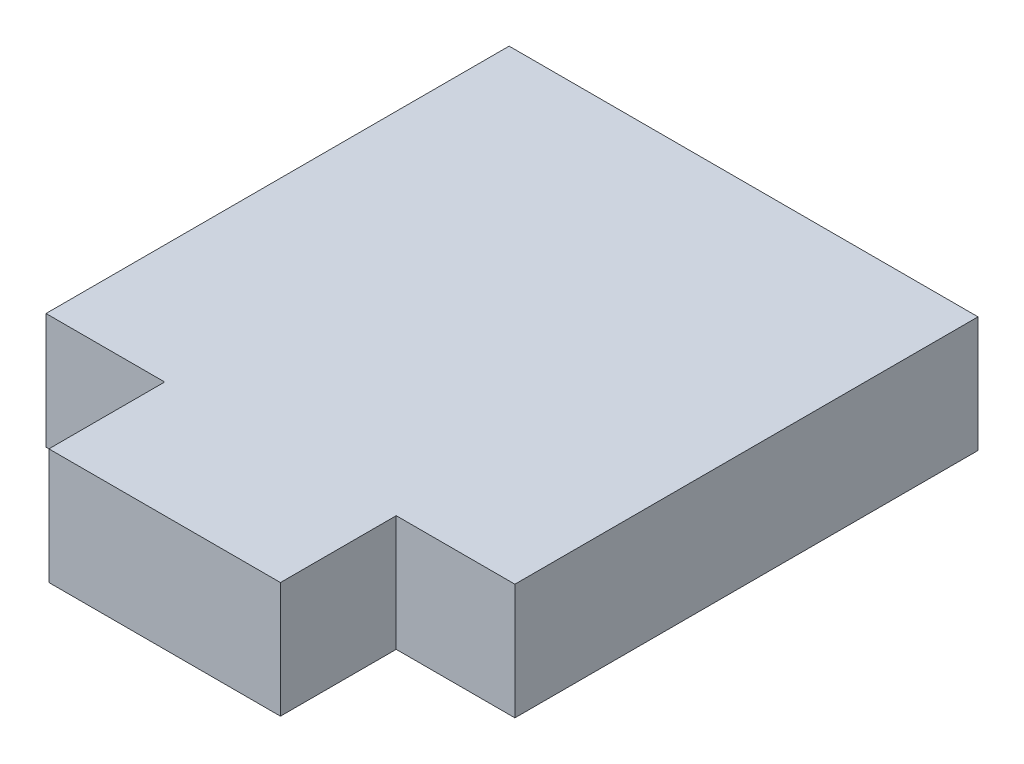
ISO-10303-21;
HEADER;
FILE_DESCRIPTION(('STEP AP214'),'2;1');
FILE_NAME('part.step','',(''),(''),'','','');
FILE_SCHEMA(('AUTOMOTIVE_DESIGN { 1 0 10303 214 1 1 1 1 }'));
ENDSEC;
DATA;
#1=APPLICATION_CONTEXT('core data for automotive mechanical design processes');
#2=APPLICATION_PROTOCOL_DEFINITION('international standard','automotive_design',2000,#1);
#3=PRODUCT_CONTEXT('',#1,'mechanical');
#4=PRODUCT('Part','Part','',(#3));
#5=PRODUCT_RELATED_PRODUCT_CATEGORY('part','',(#4));
#6=PRODUCT_DEFINITION_FORMATION('','',#4);
#7=PRODUCT_DEFINITION_CONTEXT('part definition',#1,'design');
#8=PRODUCT_DEFINITION('design','',#6,#7);
#9=PRODUCT_DEFINITION_SHAPE('','',#8);
#10=(LENGTH_UNIT() NAMED_UNIT(*) SI_UNIT(.MILLI.,.METRE.));
#11=(NAMED_UNIT(*) PLANE_ANGLE_UNIT() SI_UNIT($,.RADIAN.));
#12=(NAMED_UNIT(*) SI_UNIT($,.STERADIAN.) SOLID_ANGLE_UNIT());
#13=UNCERTAINTY_MEASURE_WITH_UNIT(LENGTH_MEASURE(1.E-05),#10,'distance_accuracy_value','');
#14=(GEOMETRIC_REPRESENTATION_CONTEXT(3) GLOBAL_UNCERTAINTY_ASSIGNED_CONTEXT((#13)) GLOBAL_UNIT_ASSIGNED_CONTEXT((#10,
#11,#12)) REPRESENTATION_CONTEXT('',''));
#15=CARTESIAN_POINT('',(0.,0.,0.));
#16=DIRECTION('',(0.,0.,1.));
#17=DIRECTION('',(1.,0.,0.));
#18=AXIS2_PLACEMENT_3D('',#15,#16,#17);
#19=CARTESIAN_POINT('',(0.,6.35,0.));
#20=DIRECTION('',(0.,0.,-1.));
#21=DIRECTION('',(-1.,0.,0.));
#22=AXIS2_PLACEMENT_3D('',#19,#20,#21);
#23=PLANE('',#22);
#24=DIRECTION('',(1.,0.,0.));
#25=VECTOR('',#24,1.);
#26=CARTESIAN_POINT('',(0.,0.,0.));
#27=LINE('',#26,#25);
#28=CARTESIAN_POINT('',(-6.50875,0.,0.));
#29=VERTEX_POINT('',#28);
#30=CARTESIAN_POINT('',(0.,0.,0.));
#31=VERTEX_POINT('',#30);
#32=EDGE_CURVE('E140',#29,#31,#27,.T.);
#33=ORIENTED_EDGE('',*,*,#32,.T.);
#34=DIRECTION('',(0.,-1.,0.));
#35=VECTOR('',#34,1.);
#36=CARTESIAN_POINT('',(0.,6.35,0.));
#37=LINE('',#36,#35);
#38=CARTESIAN_POINT('',(0.,6.35,0.));
#39=VERTEX_POINT('',#38);
#40=EDGE_CURVE('E11',#39,#31,#37,.T.);
#41=ORIENTED_EDGE('',*,*,#40,.F.);
#42=DIRECTION('',(1.,0.,0.));
#43=VECTOR('',#42,1.);
#44=CARTESIAN_POINT('',(0.,6.35,0.));
#45=LINE('',#44,#43);
#46=CARTESIAN_POINT('',(-6.50875,6.35,0.));
#47=VERTEX_POINT('',#46);
#48=EDGE_CURVE('E162',#47,#39,#45,.T.);
#49=ORIENTED_EDGE('',*,*,#48,.F.);
#50=DIRECTION('',(0.,-1.,0.));
#51=VECTOR('',#50,1.);
#52=CARTESIAN_POINT('',(-6.50875,6.35,0.));
#53=LINE('',#52,#51);
#54=EDGE_CURVE('E136',#47,#29,#53,.T.);
#55=ORIENTED_EDGE('',*,*,#54,.T.);
#56=EDGE_LOOP('',(#33,#41,#49,#55));
#57=FACE_BOUND('',#56,.T.);
#58=ADVANCED_FACE('F39',(#57),#23,.F.);
#59=CARTESIAN_POINT('',(0.,6.35,-25.4));
#60=DIRECTION('',(-1.,0.,0.));
#61=DIRECTION('',(0.,0.,1.));
#62=AXIS2_PLACEMENT_3D('',#59,#60,#61);
#63=PLANE('',#62);
#64=DIRECTION('',(0.,0.,-1.));
#65=VECTOR('',#64,1.);
#66=CARTESIAN_POINT('',(0.,0.,-25.4));
#67=LINE('',#66,#65);
#68=CARTESIAN_POINT('',(0.,0.,-25.4));
#69=VERTEX_POINT('',#68);
#70=EDGE_CURVE('E144',#31,#69,#67,.T.);
#71=ORIENTED_EDGE('',*,*,#70,.T.);
#72=DIRECTION('',(0.,-1.,0.));
#73=VECTOR('',#72,1.);
#74=CARTESIAN_POINT('',(0.,6.35,-25.4));
#75=LINE('',#74,#73);
#76=CARTESIAN_POINT('',(0.,6.35,-25.4));
#77=VERTEX_POINT('',#76);
#78=EDGE_CURVE('E48',#77,#69,#75,.T.);
#79=ORIENTED_EDGE('',*,*,#78,.F.);
#80=DIRECTION('',(0.,0.,-1.));
#81=VECTOR('',#80,1.);
#82=CARTESIAN_POINT('',(0.,6.35,-25.4));
#83=LINE('',#82,#81);
#84=EDGE_CURVE('E99',#39,#77,#83,.T.);
#85=ORIENTED_EDGE('',*,*,#84,.F.);
#86=ORIENTED_EDGE('',*,*,#40,.T.);
#87=EDGE_LOOP('',(#71,#79,#85,#86));
#88=FACE_BOUND('',#87,.T.);
#89=ADVANCED_FACE('F208',(#88),#63,.F.);
#90=CARTESIAN_POINT('',(-25.7175,6.35,-25.4));
#91=DIRECTION('',(0.,0.,1.));
#92=DIRECTION('',(1.,0.,0.));
#93=AXIS2_PLACEMENT_3D('',#90,#91,#92);
#94=PLANE('',#93);
#95=DIRECTION('',(-1.,0.,0.));
#96=VECTOR('',#95,1.);
#97=CARTESIAN_POINT('',(-25.7175,0.,-25.4));
#98=LINE('',#97,#96);
#99=CARTESIAN_POINT('',(-25.7175,0.,-25.4));
#100=VERTEX_POINT('',#99);
#101=EDGE_CURVE('E147',#69,#100,#98,.T.);
#102=ORIENTED_EDGE('',*,*,#101,.T.);
#103=DIRECTION('',(0.,-1.,0.));
#104=VECTOR('',#103,1.);
#105=CARTESIAN_POINT('',(-25.7175,6.35,-25.4));
#106=LINE('',#105,#104);
#107=CARTESIAN_POINT('',(-25.7175,6.35,-25.4));
#108=VERTEX_POINT('',#107);
#109=EDGE_CURVE('E173',#108,#100,#106,.T.);
#110=ORIENTED_EDGE('',*,*,#109,.F.);
#111=DIRECTION('',(-1.,0.,0.));
#112=VECTOR('',#111,1.);
#113=CARTESIAN_POINT('',(-25.7175,6.35,-25.4));
#114=LINE('',#113,#112);
#115=EDGE_CURVE('E183',#77,#108,#114,.T.);
#116=ORIENTED_EDGE('',*,*,#115,.F.);
#117=ORIENTED_EDGE('',*,*,#78,.T.);
#118=EDGE_LOOP('',(#102,#110,#116,#117));
#119=FACE_BOUND('',#118,.T.);
#120=ADVANCED_FACE('F181',(#119),#94,.F.);
#121=CARTESIAN_POINT('',(-25.7175,6.35,0.));
#122=DIRECTION('',(1.,0.,0.));
#123=DIRECTION('',(0.,0.,-1.));
#124=AXIS2_PLACEMENT_3D('',#121,#122,#123);
#125=PLANE('',#124);
#126=DIRECTION('',(0.,0.,1.));
#127=VECTOR('',#126,1.);
#128=CARTESIAN_POINT('',(-25.7175,0.,0.));
#129=LINE('',#128,#127);
#130=CARTESIAN_POINT('',(-25.7175,0.,0.));
#131=VERTEX_POINT('',#130);
#132=EDGE_CURVE('E150',#100,#131,#129,.T.);
#133=ORIENTED_EDGE('',*,*,#132,.T.);
#134=DIRECTION('',(0.,-1.,0.));
#135=VECTOR('',#134,1.);
#136=CARTESIAN_POINT('',(-25.7175,6.35,0.));
#137=LINE('',#136,#135);
#138=CARTESIAN_POINT('',(-25.7175,6.35,0.));
#139=VERTEX_POINT('',#138);
#140=EDGE_CURVE('E169',#139,#131,#137,.T.);
#141=ORIENTED_EDGE('',*,*,#140,.F.);
#142=DIRECTION('',(0.,0.,1.));
#143=VECTOR('',#142,1.);
#144=CARTESIAN_POINT('',(-25.7175,6.35,0.));
#145=LINE('',#144,#143);
#146=EDGE_CURVE('E196',#108,#139,#145,.T.);
#147=ORIENTED_EDGE('',*,*,#146,.F.);
#148=ORIENTED_EDGE('',*,*,#109,.T.);
#149=EDGE_LOOP('',(#133,#141,#147,#148));
#150=FACE_BOUND('',#149,.T.);
#151=ADVANCED_FACE('F191',(#150),#125,.F.);
#152=CARTESIAN_POINT('',(-19.20875,6.35,0.));
#153=DIRECTION('',(0.,0.,-1.));
#154=DIRECTION('',(-1.,0.,0.));
#155=AXIS2_PLACEMENT_3D('',#152,#153,#154);
#156=PLANE('',#155);
#157=DIRECTION('',(1.,0.,0.));
#158=VECTOR('',#157,1.);
#159=CARTESIAN_POINT('',(-19.20875,0.,0.));
#160=LINE('',#159,#158);
#161=CARTESIAN_POINT('',(-19.20875,0.,0.));
#162=VERTEX_POINT('',#161);
#163=EDGE_CURVE('E153',#131,#162,#160,.T.);
#164=ORIENTED_EDGE('',*,*,#163,.T.);
#165=DIRECTION('',(0.,-1.,0.));
#166=VECTOR('',#165,1.);
#167=CARTESIAN_POINT('',(-19.20875,6.35,0.));
#168=LINE('',#167,#166);
#169=CARTESIAN_POINT('',(-19.20875,6.35,0.));
#170=VERTEX_POINT('',#169);
#171=EDGE_CURVE('E129',#170,#162,#168,.T.);
#172=ORIENTED_EDGE('',*,*,#171,.F.);
#173=DIRECTION('',(1.,0.,0.));
#174=VECTOR('',#173,1.);
#175=CARTESIAN_POINT('',(-19.20875,6.35,0.));
#176=LINE('',#175,#174);
#177=EDGE_CURVE('E118',#139,#170,#176,.T.);
#178=ORIENTED_EDGE('',*,*,#177,.F.);
#179=ORIENTED_EDGE('',*,*,#140,.T.);
#180=EDGE_LOOP('',(#164,#172,#178,#179));
#181=FACE_BOUND('',#180,.T.);
#182=ADVANCED_FACE('F194',(#181),#156,.F.);
#183=CARTESIAN_POINT('',(-19.20875,6.35,6.35));
#184=DIRECTION('',(1.,0.,0.));
#185=DIRECTION('',(0.,0.,-1.));
#186=AXIS2_PLACEMENT_3D('',#183,#184,#185);
#187=PLANE('',#186);
#188=DIRECTION('',(0.,0.,1.));
#189=VECTOR('',#188,1.);
#190=CARTESIAN_POINT('',(-19.20875,0.,6.35));
#191=LINE('',#190,#189);
#192=CARTESIAN_POINT('',(-19.20875,0.,6.35));
#193=VERTEX_POINT('',#192);
#194=EDGE_CURVE('E127',#162,#193,#191,.T.);
#195=ORIENTED_EDGE('',*,*,#194,.T.);
#196=DIRECTION('',(0.,-1.,0.));
#197=VECTOR('',#196,1.);
#198=CARTESIAN_POINT('',(-19.20875,6.35,6.35));
#199=LINE('',#198,#197);
#200=CARTESIAN_POINT('',(-19.20875,6.35,6.35));
#201=VERTEX_POINT('',#200);
#202=EDGE_CURVE('E124',#201,#193,#199,.T.);
#203=ORIENTED_EDGE('',*,*,#202,.F.);
#204=DIRECTION('',(0.,0.,1.));
#205=VECTOR('',#204,1.);
#206=CARTESIAN_POINT('',(-19.20875,6.35,6.35));
#207=LINE('',#206,#205);
#208=EDGE_CURVE('E112',#170,#201,#207,.T.);
#209=ORIENTED_EDGE('',*,*,#208,.F.);
#210=ORIENTED_EDGE('',*,*,#171,.T.);
#211=EDGE_LOOP('',(#195,#203,#209,#210));
#212=FACE_BOUND('',#211,.T.);
#213=ADVANCED_FACE('F125',(#212),#187,.F.);
#214=CARTESIAN_POINT('',(-6.50875,6.35,6.35));
#215=DIRECTION('',(0.,0.,-1.));
#216=DIRECTION('',(-1.,0.,0.));
#217=AXIS2_PLACEMENT_3D('',#214,#215,#216);
#218=PLANE('',#217);
#219=DIRECTION('',(1.,0.,0.));
#220=VECTOR('',#219,1.);
#221=CARTESIAN_POINT('',(-6.50875,0.,6.35));
#222=LINE('',#221,#220);
#223=CARTESIAN_POINT('',(-6.50875,0.,6.35));
#224=VERTEX_POINT('',#223);
#225=EDGE_CURVE('E85',#193,#224,#222,.T.);
#226=ORIENTED_EDGE('',*,*,#225,.T.);
#227=DIRECTION('',(0.,-1.,0.));
#228=VECTOR('',#227,1.);
#229=CARTESIAN_POINT('',(-6.50875,6.35,6.35));
#230=LINE('',#229,#228);
#231=CARTESIAN_POINT('',(-6.50875,6.35,6.35));
#232=VERTEX_POINT('',#231);
#233=EDGE_CURVE('E130',#232,#224,#230,.T.);
#234=ORIENTED_EDGE('',*,*,#233,.F.);
#235=DIRECTION('',(1.,0.,0.));
#236=VECTOR('',#235,1.);
#237=CARTESIAN_POINT('',(-6.50875,6.35,6.35));
#238=LINE('',#237,#236);
#239=EDGE_CURVE('E116',#201,#232,#238,.T.);
#240=ORIENTED_EDGE('',*,*,#239,.F.);
#241=ORIENTED_EDGE('',*,*,#202,.T.);
#242=EDGE_LOOP('',(#226,#234,#240,#241));
#243=FACE_BOUND('',#242,.T.);
#244=ADVANCED_FACE('F132',(#243),#218,.F.);
#245=CARTESIAN_POINT('',(-6.50875,6.35,0.));
#246=DIRECTION('',(-1.,0.,0.));
#247=DIRECTION('',(0.,0.,1.));
#248=AXIS2_PLACEMENT_3D('',#245,#246,#247);
#249=PLANE('',#248);
#250=DIRECTION('',(0.,0.,-1.));
#251=VECTOR('',#250,1.);
#252=CARTESIAN_POINT('',(-6.50875,0.,0.));
#253=LINE('',#252,#251);
#254=EDGE_CURVE('E91',#224,#29,#253,.T.);
#255=ORIENTED_EDGE('',*,*,#254,.T.);
#256=ORIENTED_EDGE('',*,*,#54,.F.);
#257=DIRECTION('',(0.,0.,-1.));
#258=VECTOR('',#257,1.);
#259=CARTESIAN_POINT('',(-6.50875,6.35,0.));
#260=LINE('',#259,#258);
#261=EDGE_CURVE('E56',#232,#47,#260,.T.);
#262=ORIENTED_EDGE('',*,*,#261,.F.);
#263=ORIENTED_EDGE('',*,*,#233,.T.);
#264=EDGE_LOOP('',(#255,#256,#262,#263));
#265=FACE_BOUND('',#264,.T.);
#266=ADVANCED_FACE('F224',(#265),#249,.F.);
#267=CARTESIAN_POINT('',(0.,6.35,0.));
#268=DIRECTION('',(0.,1.,0.));
#269=DIRECTION('',(0.,0.,1.));
#270=AXIS2_PLACEMENT_3D('',#267,#268,#269);
#271=PLANE('',#270);
#272=ORIENTED_EDGE('',*,*,#48,.T.);
#273=ORIENTED_EDGE('',*,*,#84,.T.);
#274=ORIENTED_EDGE('',*,*,#115,.T.);
#275=ORIENTED_EDGE('',*,*,#146,.T.);
#276=ORIENTED_EDGE('',*,*,#177,.T.);
#277=ORIENTED_EDGE('',*,*,#208,.T.);
#278=ORIENTED_EDGE('',*,*,#239,.T.);
#279=ORIENTED_EDGE('',*,*,#261,.T.);
#280=EDGE_LOOP('',(#272,#273,#274,#275,#276,#277,#278,#279));
#281=FACE_BOUND('',#280,.T.);
#282=ADVANCED_FACE('F114',(#281),#271,.T.);
#283=CARTESIAN_POINT('',(0.,0.,0.));
#284=DIRECTION('',(0.,1.,0.));
#285=DIRECTION('',(0.,0.,1.));
#286=AXIS2_PLACEMENT_3D('',#283,#284,#285);
#287=PLANE('',#286);
#288=ORIENTED_EDGE('',*,*,#32,.F.);
#289=ORIENTED_EDGE('',*,*,#254,.F.);
#290=ORIENTED_EDGE('',*,*,#225,.F.);
#291=ORIENTED_EDGE('',*,*,#194,.F.);
#292=ORIENTED_EDGE('',*,*,#163,.F.);
#293=ORIENTED_EDGE('',*,*,#132,.F.);
#294=ORIENTED_EDGE('',*,*,#101,.F.);
#295=ORIENTED_EDGE('',*,*,#70,.F.);
#296=EDGE_LOOP('',(#288,#289,#290,#291,#292,#293,#294,#295));
#297=FACE_BOUND('',#296,.T.);
#298=ADVANCED_FACE('F187',(#297),#287,.F.);
#299=CLOSED_SHELL('',(#58,#89,#120,#151,#182,#213,#244,#266,#282,#298));
#300=MANIFOLD_SOLID_BREP('B2',#299);
#301=ADVANCED_BREP_SHAPE_REPRESENTATION('',(#18,#300),#14);
#302=SHAPE_DEFINITION_REPRESENTATION(#9,#301);
ENDSEC;
END-ISO-10303-21;
